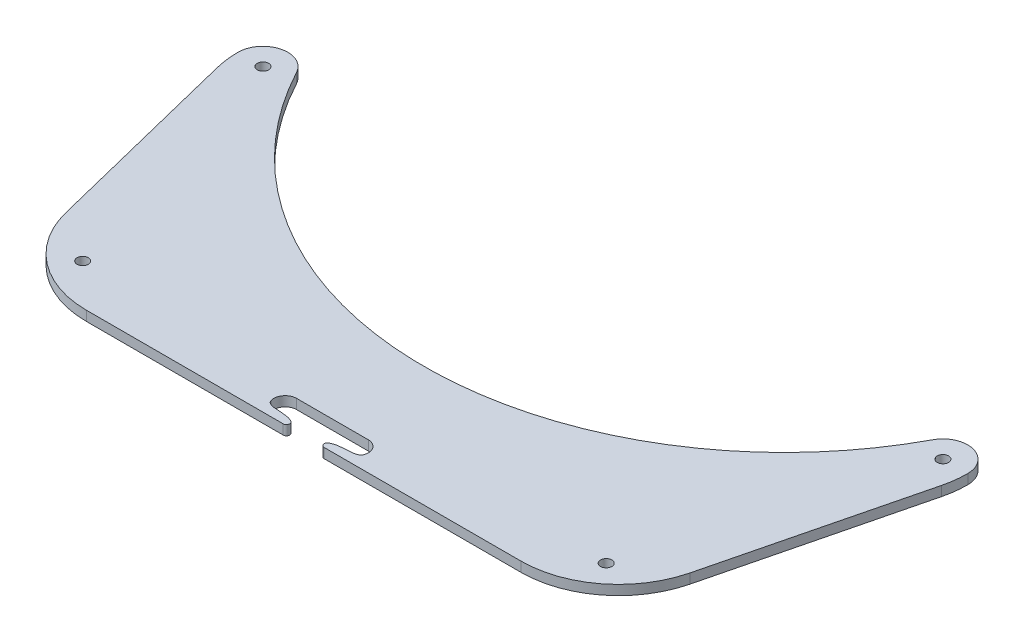
ISO-10303-21;
HEADER;
FILE_DESCRIPTION(('STEP AP214'),'2;1');
FILE_NAME('part.step','',(''),(''),'','','');
FILE_SCHEMA(('AUTOMOTIVE_DESIGN { 1 0 10303 214 1 1 1 1 }'));
ENDSEC;
DATA;
#1=APPLICATION_CONTEXT('core data for automotive mechanical design processes');
#2=APPLICATION_PROTOCOL_DEFINITION('international standard','automotive_design',2000,#1);
#3=PRODUCT_CONTEXT('',#1,'mechanical');
#4=PRODUCT('Part','Part','',(#3));
#5=PRODUCT_RELATED_PRODUCT_CATEGORY('part','',(#4));
#6=PRODUCT_DEFINITION_FORMATION('','',#4);
#7=PRODUCT_DEFINITION_CONTEXT('part definition',#1,'design');
#8=PRODUCT_DEFINITION('design','',#6,#7);
#9=PRODUCT_DEFINITION_SHAPE('','',#8);
#10=(LENGTH_UNIT() NAMED_UNIT(*) SI_UNIT(.MILLI.,.METRE.));
#11=(NAMED_UNIT(*) PLANE_ANGLE_UNIT() SI_UNIT($,.RADIAN.));
#12=(NAMED_UNIT(*) SI_UNIT($,.STERADIAN.) SOLID_ANGLE_UNIT());
#13=UNCERTAINTY_MEASURE_WITH_UNIT(LENGTH_MEASURE(1.E-05),#10,'distance_accuracy_value','');
#14=(GEOMETRIC_REPRESENTATION_CONTEXT(3) GLOBAL_UNCERTAINTY_ASSIGNED_CONTEXT((#13)) GLOBAL_UNIT_ASSIGNED_CONTEXT((#10,
#11,#12)) REPRESENTATION_CONTEXT('',''));
#15=CARTESIAN_POINT('',(0.,0.,0.));
#16=DIRECTION('',(0.,0.,1.));
#17=DIRECTION('',(1.,0.,0.));
#18=AXIS2_PLACEMENT_3D('',#15,#16,#17);
#19=CARTESIAN_POINT('',(0.,3.,29.3456606023015));
#20=DIRECTION('',(0.,0.,-1.));
#21=DIRECTION('',(-1.,0.,0.));
#22=AXIS2_PLACEMENT_3D('',#19,#20,#21);
#23=PLANE('',#22);
#24=DIRECTION('',(0.,1.,0.));
#25=VECTOR('',#24,1.);
#26=CARTESIAN_POINT('',(-6.29344842056771,-7.,29.3456606023015));
#27=LINE('',#26,#25);
#28=CARTESIAN_POINT('',(-6.29344842056771,0.,29.3456606023015));
#29=VERTEX_POINT('',#28);
#30=CARTESIAN_POINT('',(-6.29344842056771,3.,29.3456606023015));
#31=VERTEX_POINT('',#30);
#32=EDGE_CURVE('E210',#29,#31,#27,.T.);
#33=ORIENTED_EDGE('',*,*,#32,.T.);
#34=DIRECTION('',(1.,0.,0.));
#35=VECTOR('',#34,1.);
#36=CARTESIAN_POINT('',(0.,3.,29.3456606023015));
#37=LINE('',#36,#35);
#38=CARTESIAN_POINT('',(-66.7805914104085,3.,29.3456606023015));
#39=VERTEX_POINT('',#38);
#40=EDGE_CURVE('E260',#39,#31,#37,.T.);
#41=ORIENTED_EDGE('',*,*,#40,.F.);
#42=DIRECTION('',(0.,-1.,0.));
#43=VECTOR('',#42,1.);
#44=CARTESIAN_POINT('',(-66.7805914104085,3.,29.3456606023015));
#45=LINE('',#44,#43);
#46=CARTESIAN_POINT('',(-66.7805914104085,0.,29.3456606023015));
#47=VERTEX_POINT('',#46);
#48=EDGE_CURVE('E297',#39,#47,#45,.T.);
#49=ORIENTED_EDGE('',*,*,#48,.T.);
#50=DIRECTION('',(1.,0.,0.));
#51=VECTOR('',#50,1.);
#52=CARTESIAN_POINT('',(0.,0.,29.3456606023015));
#53=LINE('',#52,#51);
#54=EDGE_CURVE('E280',#47,#29,#53,.T.);
#55=ORIENTED_EDGE('',*,*,#54,.T.);
#56=EDGE_LOOP('',(#33,#41,#49,#55));
#57=FACE_BOUND('',#56,.T.);
#58=ADVANCED_FACE('F37',(#57),#23,.F.);
#59=CARTESIAN_POINT('',(-82.1474387367497,3.,-62.6241657822366));
#60=DIRECTION('',(0.,-1.,0.));
#61=DIRECTION('',(0.,0.,-1.));
#62=AXIS2_PLACEMENT_3D('',#59,#60,#61);
#63=CYLINDRICAL_SURFACE('',#62,30.);
#64=DIRECTION('',(0.,1.,0.));
#65=VECTOR('',#64,1.);
#66=CARTESIAN_POINT('',(-112.14743873675,-7.,-62.6241657822366));
#67=LINE('',#66,#65);
#68=CARTESIAN_POINT('',(-112.14743873675,0.,-62.6241657822366));
#69=VERTEX_POINT('',#68);
#70=CARTESIAN_POINT('',(-112.14743873675,3.,-62.6241657822366));
#71=VERTEX_POINT('',#70);
#72=EDGE_CURVE('E241',#69,#71,#67,.T.);
#73=ORIENTED_EDGE('',*,*,#72,.F.);
#74=CARTESIAN_POINT('',(-82.1474387367497,0.,-62.6241657822366));
#75=DIRECTION('',(0.,1.,0.));
#76=DIRECTION('',(0.,0.,1.));
#77=AXIS2_PLACEMENT_3D('',#74,#75,#76);
#78=CIRCLE('',#77,30.);
#79=CARTESIAN_POINT('',(-111.265547961007,0.,-55.4036592069183));
#80=VERTEX_POINT('',#79);
#81=EDGE_CURVE('E245',#69,#80,#78,.T.);
#82=ORIENTED_EDGE('',*,*,#81,.T.);
#83=DIRECTION('',(0.,-1.,0.));
#84=VECTOR('',#83,1.);
#85=CARTESIAN_POINT('',(-111.265547961007,3.,-55.4036592069183));
#86=LINE('',#85,#84);
#87=CARTESIAN_POINT('',(-111.265547961007,3.,-55.4036592069183));
#88=VERTEX_POINT('',#87);
#89=EDGE_CURVE('E301',#88,#80,#86,.T.);
#90=ORIENTED_EDGE('',*,*,#89,.F.);
#91=CARTESIAN_POINT('',(-82.1474387367497,3.,-62.6241657822366));
#92=DIRECTION('',(0.,1.,0.));
#93=DIRECTION('',(0.,0.,1.));
#94=AXIS2_PLACEMENT_3D('',#91,#92,#93);
#95=CIRCLE('',#94,30.);
#96=EDGE_CURVE('E250',#71,#88,#95,.T.);
#97=ORIENTED_EDGE('',*,*,#96,.F.);
#98=EDGE_LOOP('',(#73,#82,#90,#97));
#99=FACE_BOUND('',#98,.T.);
#100=ADVANCED_FACE('F39',(#99),#63,.T.);
#101=CARTESIAN_POINT('',(-91.8773371714655,3.,22.7831042208141));
#102=DIRECTION('',(-0.970603640808581,0.,0.24068355251061));
#103=DIRECTION('',(0.24068355251061,0.,0.970603640808581));
#104=AXIS2_PLACEMENT_3D('',#101,#102,#103);
#105=PLANE('',#104);
#106=DIRECTION('',(-0.24068355251061,0.,-0.970603640808581));
#107=VECTOR('',#106,1.);
#108=CARTESIAN_POINT('',(-91.8773371714655,0.,22.7831042208141));
#109=LINE('',#108,#107);
#110=CARTESIAN_POINT('',(-95.8987006346659,0.,6.56616717761984));
#111=VERTEX_POINT('',#110);
#112=EDGE_CURVE('E273',#111,#80,#109,.T.);
#113=ORIENTED_EDGE('',*,*,#112,.F.);
#114=DIRECTION('',(0.,-1.,0.));
#115=VECTOR('',#114,1.);
#116=CARTESIAN_POINT('',(-95.8987006346659,3.,6.56616717761984));
#117=LINE('',#116,#115);
#118=CARTESIAN_POINT('',(-95.8987006346659,3.,6.56616717761984));
#119=VERTEX_POINT('',#118);
#120=EDGE_CURVE('E299',#119,#111,#117,.T.);
#121=ORIENTED_EDGE('',*,*,#120,.F.);
#122=DIRECTION('',(-0.24068355251061,0.,-0.970603640808581));
#123=VECTOR('',#122,1.);
#124=CARTESIAN_POINT('',(-91.8773371714655,3.,22.7831042208141));
#125=LINE('',#124,#123);
#126=EDGE_CURVE('E252',#119,#88,#125,.T.);
#127=ORIENTED_EDGE('',*,*,#126,.T.);
#128=ORIENTED_EDGE('',*,*,#89,.T.);
#129=EDGE_LOOP('',(#113,#121,#127,#128));
#130=FACE_BOUND('',#129,.T.);
#131=ADVANCED_FACE('F384',(#130),#105,.T.);
#132=CARTESIAN_POINT('',(-66.7805914104085,3.,-0.654339397698461));
#133=DIRECTION('',(0.,-1.,0.));
#134=DIRECTION('',(0.,0.,-1.));
#135=AXIS2_PLACEMENT_3D('',#132,#133,#134);
#136=CYLINDRICAL_SURFACE('',#135,30.);
#137=CARTESIAN_POINT('',(-66.7805914104085,0.,-0.654339397698461));
#138=DIRECTION('',(0.,1.,0.));
#139=DIRECTION('',(0.,0.,1.));
#140=AXIS2_PLACEMENT_3D('',#137,#138,#139);
#141=CIRCLE('',#140,30.);
#142=EDGE_CURVE('E276',#47,#111,#141,.F.);
#143=ORIENTED_EDGE('',*,*,#142,.F.);
#144=ORIENTED_EDGE('',*,*,#48,.F.);
#145=CARTESIAN_POINT('',(-66.7805914104085,3.,-0.654339397698461));
#146=DIRECTION('',(0.,1.,0.));
#147=DIRECTION('',(0.,0.,1.));
#148=AXIS2_PLACEMENT_3D('',#145,#146,#147);
#149=CIRCLE('',#148,30.);
#150=EDGE_CURVE('E256',#39,#119,#149,.F.);
#151=ORIENTED_EDGE('',*,*,#150,.T.);
#152=ORIENTED_EDGE('',*,*,#120,.T.);
#153=EDGE_LOOP('',(#143,#144,#151,#152));
#154=FACE_BOUND('',#153,.T.);
#155=ADVANCED_FACE('F388',(#154),#136,.T.);
#156=CARTESIAN_POINT('',(6.29344842056773,3.,29.3456606023015));
#157=VERTEX_POINT('',#156);
#158=CARTESIAN_POINT('',(66.7805914104085,3.,29.3456606023015));
#159=VERTEX_POINT('',#158);
#160=EDGE_CURVE('E259',#157,#159,#37,.T.);
#161=ORIENTED_EDGE('',*,*,#160,.F.);
#162=DIRECTION('',(0.,1.,0.));
#163=VECTOR('',#162,1.);
#164=CARTESIAN_POINT('',(6.29344842056773,-7.,29.3456606023015));
#165=LINE('',#164,#163);
#166=CARTESIAN_POINT('',(6.29344842056773,0.,29.3456606023015));
#167=VERTEX_POINT('',#166);
#168=EDGE_CURVE('E208',#167,#157,#165,.T.);
#169=ORIENTED_EDGE('',*,*,#168,.F.);
#170=CARTESIAN_POINT('',(66.7805914104085,0.,29.3456606023015));
#171=VERTEX_POINT('',#170);
#172=EDGE_CURVE('E279',#167,#171,#53,.T.);
#173=ORIENTED_EDGE('',*,*,#172,.T.);
#174=DIRECTION('',(0.,-1.,0.));
#175=VECTOR('',#174,1.);
#176=CARTESIAN_POINT('',(66.7805914104085,3.,29.3456606023015));
#177=LINE('',#176,#175);
#178=EDGE_CURVE('E294',#159,#171,#177,.T.);
#179=ORIENTED_EDGE('',*,*,#178,.F.);
#180=EDGE_LOOP('',(#161,#169,#173,#179));
#181=FACE_BOUND('',#180,.T.);
#182=ADVANCED_FACE('F355',(#181),#23,.F.);
#183=CARTESIAN_POINT('',(66.7805914104085,3.,-0.654339397698461));
#184=DIRECTION('',(0.,-1.,0.));
#185=DIRECTION('',(0.,0.,-1.));
#186=AXIS2_PLACEMENT_3D('',#183,#184,#185);
#187=CYLINDRICAL_SURFACE('',#186,30.);
#188=CARTESIAN_POINT('',(66.7805914104085,0.,-0.654339397698461));
#189=DIRECTION('',(0.,1.,0.));
#190=DIRECTION('',(0.,0.,1.));
#191=AXIS2_PLACEMENT_3D('',#188,#189,#190);
#192=CIRCLE('',#191,30.);
#193=CARTESIAN_POINT('',(95.8987006346659,0.,6.56616717761984));
#194=VERTEX_POINT('',#193);
#195=EDGE_CURVE('E283',#194,#171,#192,.F.);
#196=ORIENTED_EDGE('',*,*,#195,.F.);
#197=DIRECTION('',(0.,-1.,0.));
#198=VECTOR('',#197,1.);
#199=CARTESIAN_POINT('',(95.8987006346659,3.,6.56616717761984));
#200=LINE('',#199,#198);
#201=CARTESIAN_POINT('',(95.8987006346659,3.,6.56616717761984));
#202=VERTEX_POINT('',#201);
#203=EDGE_CURVE('E292',#202,#194,#200,.T.);
#204=ORIENTED_EDGE('',*,*,#203,.F.);
#205=CARTESIAN_POINT('',(66.7805914104085,3.,-0.654339397698461));
#206=DIRECTION('',(0.,1.,0.));
#207=DIRECTION('',(0.,0.,1.));
#208=AXIS2_PLACEMENT_3D('',#205,#206,#207);
#209=CIRCLE('',#208,30.);
#210=EDGE_CURVE('E263',#202,#159,#209,.F.);
#211=ORIENTED_EDGE('',*,*,#210,.T.);
#212=ORIENTED_EDGE('',*,*,#178,.T.);
#213=EDGE_LOOP('',(#196,#204,#211,#212));
#214=FACE_BOUND('',#213,.T.);
#215=ADVANCED_FACE('F358',(#214),#187,.T.);
#216=CARTESIAN_POINT('',(91.8773371714655,3.,22.783104220814));
#217=DIRECTION('',(-0.970603640808581,0.,-0.24068355251061));
#218=DIRECTION('',(-0.24068355251061,0.,0.970603640808581));
#219=AXIS2_PLACEMENT_3D('',#216,#217,#218);
#220=PLANE('',#219);
#221=DIRECTION('',(0.24068355251061,0.,-0.970603640808581));
#222=VECTOR('',#221,1.);
#223=CARTESIAN_POINT('',(91.8773371714655,0.,22.783104220814));
#224=LINE('',#223,#222);
#225=CARTESIAN_POINT('',(111.265547961007,0.,-55.4036592069183));
#226=VERTEX_POINT('',#225);
#227=EDGE_CURVE('E286',#194,#226,#224,.T.);
#228=ORIENTED_EDGE('',*,*,#227,.T.);
#229=DIRECTION('',(0.,-1.,0.));
#230=VECTOR('',#229,1.);
#231=CARTESIAN_POINT('',(111.265547961007,3.,-55.4036592069183));
#232=LINE('',#231,#230);
#233=CARTESIAN_POINT('',(111.265547961007,3.,-55.4036592069183));
#234=VERTEX_POINT('',#233);
#235=EDGE_CURVE('E271',#234,#226,#232,.T.);
#236=ORIENTED_EDGE('',*,*,#235,.F.);
#237=DIRECTION('',(0.24068355251061,0.,-0.970603640808581));
#238=VECTOR('',#237,1.);
#239=CARTESIAN_POINT('',(91.8773371714655,3.,22.783104220814));
#240=LINE('',#239,#238);
#241=EDGE_CURVE('E266',#202,#234,#240,.T.);
#242=ORIENTED_EDGE('',*,*,#241,.F.);
#243=ORIENTED_EDGE('',*,*,#203,.T.);
#244=EDGE_LOOP('',(#228,#236,#242,#243));
#245=FACE_BOUND('',#244,.T.);
#246=ADVANCED_FACE('F364',(#245),#220,.F.);
#247=CARTESIAN_POINT('',(82.1474387367497,3.,-62.6241657822366));
#248=DIRECTION('',(0.,-1.,0.));
#249=DIRECTION('',(0.,0.,-1.));
#250=AXIS2_PLACEMENT_3D('',#247,#248,#249);
#251=CYLINDRICAL_SURFACE('',#250,30.);
#252=CARTESIAN_POINT('',(82.1474387367497,0.,-62.6241657822366));
#253=DIRECTION('',(0.,1.,0.));
#254=DIRECTION('',(0.,0.,1.));
#255=AXIS2_PLACEMENT_3D('',#252,#253,#254);
#256=CIRCLE('',#255,30.);
#257=CARTESIAN_POINT('',(112.14743873675,0.,-62.6241657822366));
#258=VERTEX_POINT('',#257);
#259=EDGE_CURVE('E253',#226,#258,#256,.T.);
#260=ORIENTED_EDGE('',*,*,#259,.T.);
#261=DIRECTION('',(0.,1.,0.));
#262=VECTOR('',#261,1.);
#263=CARTESIAN_POINT('',(112.14743873675,-7.,-62.6241657822366));
#264=LINE('',#263,#262);
#265=CARTESIAN_POINT('',(112.14743873675,3.,-62.6241657822366));
#266=VERTEX_POINT('',#265);
#267=EDGE_CURVE('E242',#258,#266,#264,.T.);
#268=ORIENTED_EDGE('',*,*,#267,.T.);
#269=CARTESIAN_POINT('',(82.1474387367497,3.,-62.6241657822366));
#270=DIRECTION('',(0.,1.,0.));
#271=DIRECTION('',(0.,0.,1.));
#272=AXIS2_PLACEMENT_3D('',#269,#270,#271);
#273=CIRCLE('',#272,30.);
#274=EDGE_CURVE('E268',#234,#266,#273,.T.);
#275=ORIENTED_EDGE('',*,*,#274,.F.);
#276=ORIENTED_EDGE('',*,*,#235,.T.);
#277=EDGE_LOOP('',(#260,#268,#275,#276));
#278=FACE_BOUND('',#277,.T.);
#279=ADVANCED_FACE('F368',(#278),#251,.T.);
#280=CARTESIAN_POINT('',(0.,3.,0.));
#281=DIRECTION('',(0.,1.,0.));
#282=DIRECTION('',(0.,0.,1.));
#283=AXIS2_PLACEMENT_3D('',#280,#281,#282);
#284=PLANE('',#283);
#285=CARTESIAN_POINT('',(6.29344842056773,3.,28.3456606023015));
#286=DIRECTION('',(0.,-1.,0.));
#287=DIRECTION('',(0.,0.,1.));
#288=AXIS2_PLACEMENT_3D('',#285,#286,#287);
#289=CIRCLE('',#288,1.);
#290=CARTESIAN_POINT('',(5.80457635502105,3.,27.4733051108142));
#291=VERTEX_POINT('',#290);
#292=EDGE_CURVE('E170',#157,#291,#289,.T.);
#293=ORIENTED_EDGE('',*,*,#292,.F.);
#294=ORIENTED_EDGE('',*,*,#160,.T.);
#295=ORIENTED_EDGE('',*,*,#210,.F.);
#296=ORIENTED_EDGE('',*,*,#241,.T.);
#297=ORIENTED_EDGE('',*,*,#274,.T.);
#298=CARTESIAN_POINT('',(104.507530950677,3.,-62.6241657822366));
#299=DIRECTION('',(0.,-1.,0.));
#300=DIRECTION('',(0.,0.,-1.));
#301=AXIS2_PLACEMENT_3D('',#298,#299,#300);
#302=CIRCLE('',#301,7.63990778607278);
#303=CARTESIAN_POINT('',(97.7669860145428,3.,-66.2204478823578));
#304=VERTEX_POINT('',#303);
#305=EDGE_CURVE('E239',#304,#266,#302,.T.);
#306=ORIENTED_EDGE('',*,*,#305,.F.);
#307=CARTESIAN_POINT('',(0.,3.,-118.382055752085));
#308=DIRECTION('',(0.,1.,0.));
#309=DIRECTION('',(0.,0.,1.));
#310=AXIS2_PLACEMENT_3D('',#307,#308,#309);
#311=CIRCLE('',#310,110.811627954484);
#312=CARTESIAN_POINT('',(-97.7669860145428,3.,-66.2204478823579));
#313=VERTEX_POINT('',#312);
#314=EDGE_CURVE('E236',#313,#304,#311,.T.);
#315=ORIENTED_EDGE('',*,*,#314,.F.);
#316=CARTESIAN_POINT('',(-104.507530950677,3.,-62.6241657822366));
#317=DIRECTION('',(0.,-1.,0.));
#318=DIRECTION('',(0.,0.,1.));
#319=AXIS2_PLACEMENT_3D('',#316,#317,#318);
#320=CIRCLE('',#319,7.6399077860728);
#321=EDGE_CURVE('E234',#71,#313,#320,.T.);
#322=ORIENTED_EDGE('',*,*,#321,.F.);
#323=ORIENTED_EDGE('',*,*,#96,.T.);
#324=ORIENTED_EDGE('',*,*,#126,.F.);
#325=ORIENTED_EDGE('',*,*,#150,.F.);
#326=ORIENTED_EDGE('',*,*,#40,.T.);
#327=CARTESIAN_POINT('',(-6.29344842056771,3.,28.3456606023015));
#328=DIRECTION('',(0.,-1.,0.));
#329=DIRECTION('',(0.,0.,1.));
#330=AXIS2_PLACEMENT_3D('',#327,#328,#329);
#331=CIRCLE('',#330,1.);
#332=CARTESIAN_POINT('',(-5.80457635502104,3.,27.4733051108142));
#333=VERTEX_POINT('',#332);
#334=EDGE_CURVE('E200',#333,#31,#331,.T.);
#335=ORIENTED_EDGE('',*,*,#334,.F.);
#336=CARTESIAN_POINT('',(-14.3784570925038,3.,24.9876745493891));
#337=CARTESIAN_POINT('',(-14.0506615471462,3.,26.1193369399275));
#338=CARTESIAN_POINT('',(-10.489346866623,3.,26.7600909903028));
#339=CARTESIAN_POINT('',(-7.72474957365098,3.,26.4937574664827));
#340=CARTESIAN_POINT('',(-5.90450881564876,3.,27.4173024961474));
#341=CARTESIAN_POINT('',(-5.80457635502104,3.,27.4733051108142));
#342=B_SPLINE_CURVE_WITH_KNOTS('',3,(#336,#337,#338,#339,#340,#341),.UNSPECIFIED.,.F.,.F.,(4,1,
1,4),(0.,0.27412385349263,0.745489655390744,0.777393607827548),.UNSPECIFIED.);
#343=CARTESIAN_POINT('',(-14.3784570925038,3.,24.9876745493891));
#344=VERTEX_POINT('',#343);
#345=EDGE_CURVE('E195',#344,#333,#342,.T.);
#346=ORIENTED_EDGE('',*,*,#345,.F.);
#347=CARTESIAN_POINT('',(-11.0166480970681,3.,24.0138982515634));
#348=DIRECTION('',(0.,1.,0.));
#349=DIRECTION('',(0.,0.,1.));
#350=AXIS2_PLACEMENT_3D('',#347,#348,#349);
#351=CIRCLE('',#350,3.5);
#352=CARTESIAN_POINT('',(-11.0166480970681,3.,20.5138982515634));
#353=VERTEX_POINT('',#352);
#354=EDGE_CURVE('E187',#353,#344,#351,.T.);
#355=ORIENTED_EDGE('',*,*,#354,.F.);
#356=DIRECTION('',(-1.,0.,0.));
#357=VECTOR('',#356,1.);
#358=CARTESIAN_POINT('',(11.0166480970681,3.,20.5138982515634));
#359=LINE('',#358,#357);
#360=CARTESIAN_POINT('',(11.0166480970681,3.,20.5138982515634));
#361=VERTEX_POINT('',#360);
#362=EDGE_CURVE('E185',#361,#353,#359,.T.);
#363=ORIENTED_EDGE('',*,*,#362,.F.);
#364=CARTESIAN_POINT('',(11.0166480970681,3.,24.0138982515634));
#365=DIRECTION('',(0.,1.,0.));
#366=DIRECTION('',(0.,0.,1.));
#367=AXIS2_PLACEMENT_3D('',#364,#365,#366);
#368=CIRCLE('',#367,3.5);
#369=CARTESIAN_POINT('',(14.3784570925038,3.,24.9876745493891));
#370=VERTEX_POINT('',#369);
#371=EDGE_CURVE('E164',#370,#361,#368,.T.);
#372=ORIENTED_EDGE('',*,*,#371,.F.);
#373=CARTESIAN_POINT('',(5.80457635502104,3.,27.4733051108142));
#374=CARTESIAN_POINT('',(5.90450881564877,3.,27.4173024961474));
#375=CARTESIAN_POINT('',(7.724749573651,3.,26.4937574664827));
#376=CARTESIAN_POINT('',(10.489346866623,3.,26.7600909903028));
#377=CARTESIAN_POINT('',(14.0506615471462,3.,26.1193369399275));
#378=CARTESIAN_POINT('',(14.3784570925038,3.,24.9876745493891));
#379=B_SPLINE_CURVE_WITH_KNOTS('',3,(#373,#374,#375,#376,#377,#378),.UNSPECIFIED.,.F.,.F.,(4,1,
1,4),(0.,0.0319039524368033,0.503269754334918,0.777393607827548),.UNSPECIFIED.);
#380=EDGE_CURVE('E173',#291,#370,#379,.T.);
#381=ORIENTED_EDGE('',*,*,#380,.F.);
#382=EDGE_LOOP('',(#293,#294,#295,#296,#297,#306,#315,#322,#323,#324,#325,#326,#335,#346,#355,
#363,#372,#381));
#383=FACE_BOUND('',#382,.T.);
#384=CARTESIAN_POINT('',(-104.507530950677,3.,-62.6241657822366));
#385=DIRECTION('',(0.,1.,0.));
#386=DIRECTION('',(0.,0.,1.));
#387=AXIS2_PLACEMENT_3D('',#384,#385,#386);
#388=CIRCLE('',#387,1.75);
#389=CARTESIAN_POINT('',(-104.507530950677,3.,-60.8741657822366));
#390=VERTEX_POINT('',#389);
#391=EDGE_CURVE('E220',#390,#390,#388,.T.);
#392=ORIENTED_EDGE('',*,*,#391,.F.);
#393=EDGE_LOOP('',(#392));
#394=FACE_BOUND('',#393,.T.);
#395=CARTESIAN_POINT('',(104.507530950677,3.,-62.6241657822366));
#396=DIRECTION('',(0.,1.,0.));
#397=DIRECTION('',(0.,0.,1.));
#398=AXIS2_PLACEMENT_3D('',#395,#396,#397);
#399=CIRCLE('',#398,1.75);
#400=CARTESIAN_POINT('',(104.507530950677,3.,-60.8741657822366));
#401=VERTEX_POINT('',#400);
#402=EDGE_CURVE('E224',#401,#401,#399,.T.);
#403=ORIENTED_EDGE('',*,*,#402,.F.);
#404=EDGE_LOOP('',(#403));
#405=FACE_BOUND('',#404,.T.);
#406=CARTESIAN_POINT('',(80.4501847084653,3.,16.8189513065068));
#407=DIRECTION('',(0.,1.,0.));
#408=DIRECTION('',(0.,0.,1.));
#409=AXIS2_PLACEMENT_3D('',#406,#407,#408);
#410=CIRCLE('',#409,1.75);
#411=CARTESIAN_POINT('',(80.4501847084653,3.,18.5689513065068));
#412=VERTEX_POINT('',#411);
#413=EDGE_CURVE('E207',#412,#412,#410,.T.);
#414=ORIENTED_EDGE('',*,*,#413,.F.);
#415=EDGE_LOOP('',(#414));
#416=FACE_BOUND('',#415,.T.);
#417=CARTESIAN_POINT('',(-80.4501847084653,3.,16.8189513065068));
#418=DIRECTION('',(0.,1.,0.));
#419=DIRECTION('',(0.,0.,1.));
#420=AXIS2_PLACEMENT_3D('',#417,#418,#419);
#421=CIRCLE('',#420,1.75);
#422=CARTESIAN_POINT('',(-80.4501847084653,3.,18.5689513065068));
#423=VERTEX_POINT('',#422);
#424=EDGE_CURVE('E229',#423,#423,#421,.T.);
#425=ORIENTED_EDGE('',*,*,#424,.F.);
#426=EDGE_LOOP('',(#425));
#427=FACE_BOUND('',#426,.T.);
#428=ADVANCED_FACE('F181',(#383,#394,#405,#416,#427),#284,.T.);
#429=CARTESIAN_POINT('',(0.,0.,0.));
#430=DIRECTION('',(0.,1.,0.));
#431=DIRECTION('',(0.,0.,1.));
#432=AXIS2_PLACEMENT_3D('',#429,#430,#431);
#433=PLANE('',#432);
#434=ORIENTED_EDGE('',*,*,#172,.F.);
#435=CARTESIAN_POINT('',(6.29344842056773,0.,28.3456606023015));
#436=DIRECTION('',(0.,1.,0.));
#437=DIRECTION('',(0.,0.,1.));
#438=AXIS2_PLACEMENT_3D('',#435,#436,#437);
#439=CIRCLE('',#438,1.);
#440=CARTESIAN_POINT('',(5.80457635502105,0.,27.4733051108142));
#441=VERTEX_POINT('',#440);
#442=EDGE_CURVE('E11',#167,#441,#439,.F.);
#443=ORIENTED_EDGE('',*,*,#442,.T.);
#444=CARTESIAN_POINT('',(5.80457635502104,0.,27.4733051108142));
#445=CARTESIAN_POINT('',(5.90450881564877,0.,27.4173024961474));
#446=CARTESIAN_POINT('',(7.724749573651,0.,26.4937574664827));
#447=CARTESIAN_POINT('',(10.489346866623,0.,26.7600909903028));
#448=CARTESIAN_POINT('',(14.0506615471462,0.,26.1193369399275));
#449=CARTESIAN_POINT('',(14.3784570925038,0.,24.9876745493891));
#450=B_SPLINE_CURVE_WITH_KNOTS('',3,(#444,#445,#446,#447,#448,#449),.UNSPECIFIED.,.F.,.F.,(4,1,
1,4),(0.,0.0319039524368033,0.503269754334918,0.777393607827548),.UNSPECIFIED.);
#451=CARTESIAN_POINT('',(14.3784570925038,0.,24.9876745493891));
#452=VERTEX_POINT('',#451);
#453=EDGE_CURVE('E45',#441,#452,#450,.T.);
#454=ORIENTED_EDGE('',*,*,#453,.T.);
#455=CARTESIAN_POINT('',(11.0166480970681,0.,24.0138982515634));
#456=DIRECTION('',(0.,1.,0.));
#457=DIRECTION('',(0.,0.,1.));
#458=AXIS2_PLACEMENT_3D('',#455,#456,#457);
#459=CIRCLE('',#458,3.5);
#460=CARTESIAN_POINT('',(11.0166480970681,0.,20.5138982515634));
#461=VERTEX_POINT('',#460);
#462=EDGE_CURVE('E167',#452,#461,#459,.T.);
#463=ORIENTED_EDGE('',*,*,#462,.T.);
#464=DIRECTION('',(-1.,0.,0.));
#465=VECTOR('',#464,1.);
#466=CARTESIAN_POINT('',(0.,0.,20.5138982515634));
#467=LINE('',#466,#465);
#468=CARTESIAN_POINT('',(-11.0166480970681,0.,20.5138982515634));
#469=VERTEX_POINT('',#468);
#470=EDGE_CURVE('E323',#461,#469,#467,.T.);
#471=ORIENTED_EDGE('',*,*,#470,.T.);
#472=CARTESIAN_POINT('',(-11.0166480970681,0.,24.0138982515634));
#473=DIRECTION('',(0.,1.,0.));
#474=DIRECTION('',(0.,0.,1.));
#475=AXIS2_PLACEMENT_3D('',#472,#473,#474);
#476=CIRCLE('',#475,3.5);
#477=CARTESIAN_POINT('',(-14.3784570925038,0.,24.9876745493891));
#478=VERTEX_POINT('',#477);
#479=EDGE_CURVE('E326',#469,#478,#476,.T.);
#480=ORIENTED_EDGE('',*,*,#479,.T.);
#481=CARTESIAN_POINT('',(-14.3784570925038,0.,24.9876745493891));
#482=CARTESIAN_POINT('',(-14.0506615471462,0.,26.1193369399275));
#483=CARTESIAN_POINT('',(-10.489346866623,0.,26.7600909903028));
#484=CARTESIAN_POINT('',(-7.72474957365098,0.,26.4937574664827));
#485=CARTESIAN_POINT('',(-5.90450881564876,0.,27.4173024961474));
#486=CARTESIAN_POINT('',(-5.80457635502104,0.,27.4733051108142));
#487=B_SPLINE_CURVE_WITH_KNOTS('',3,(#481,#482,#483,#484,#485,#486),.UNSPECIFIED.,.F.,.F.,(4,1,
1,4),(0.,0.27412385349263,0.745489655390744,0.777393607827548),.UNSPECIFIED.);
#488=CARTESIAN_POINT('',(-5.80457635502104,0.,27.4733051108142));
#489=VERTEX_POINT('',#488);
#490=EDGE_CURVE('E329',#478,#489,#487,.T.);
#491=ORIENTED_EDGE('',*,*,#490,.T.);
#492=CARTESIAN_POINT('',(-6.29344842056771,0.,28.3456606023015));
#493=DIRECTION('',(0.,1.,0.));
#494=DIRECTION('',(0.,0.,1.));
#495=AXIS2_PLACEMENT_3D('',#492,#493,#494);
#496=CIRCLE('',#495,1.);
#497=EDGE_CURVE('E334',#489,#29,#496,.F.);
#498=ORIENTED_EDGE('',*,*,#497,.T.);
#499=ORIENTED_EDGE('',*,*,#54,.F.);
#500=ORIENTED_EDGE('',*,*,#142,.T.);
#501=ORIENTED_EDGE('',*,*,#112,.T.);
#502=ORIENTED_EDGE('',*,*,#81,.F.);
#503=CARTESIAN_POINT('',(-104.507530950677,0.,-62.6241657822366));
#504=DIRECTION('',(0.,1.,0.));
#505=DIRECTION('',(0.,0.,1.));
#506=AXIS2_PLACEMENT_3D('',#503,#504,#505);
#507=CIRCLE('',#506,7.6399077860728);
#508=CARTESIAN_POINT('',(-97.7669860145428,0.,-66.2204478823579));
#509=VERTEX_POINT('',#508);
#510=EDGE_CURVE('E304',#69,#509,#507,.F.);
#511=ORIENTED_EDGE('',*,*,#510,.T.);
#512=CARTESIAN_POINT('',(0.,0.,-118.382055752085));
#513=DIRECTION('',(0.,1.,0.));
#514=DIRECTION('',(0.,0.,1.));
#515=AXIS2_PLACEMENT_3D('',#512,#513,#514);
#516=CIRCLE('',#515,110.811627954484);
#517=CARTESIAN_POINT('',(97.7669860145428,0.,-66.2204478823578));
#518=VERTEX_POINT('',#517);
#519=EDGE_CURVE('E307',#509,#518,#516,.T.);
#520=ORIENTED_EDGE('',*,*,#519,.T.);
#521=CARTESIAN_POINT('',(104.507530950677,0.,-62.6241657822366));
#522=DIRECTION('',(0.,1.,0.));
#523=DIRECTION('',(0.,0.,1.));
#524=AXIS2_PLACEMENT_3D('',#521,#522,#523);
#525=CIRCLE('',#524,7.63990778607278);
#526=EDGE_CURVE('E310',#518,#258,#525,.F.);
#527=ORIENTED_EDGE('',*,*,#526,.T.);
#528=ORIENTED_EDGE('',*,*,#259,.F.);
#529=ORIENTED_EDGE('',*,*,#227,.F.);
#530=ORIENTED_EDGE('',*,*,#195,.T.);
#531=EDGE_LOOP('',(#434,#443,#454,#463,#471,#480,#491,#498,#499,#500,#501,#502,#511,#520,#527,
#528,#529,#530));
#532=FACE_BOUND('',#531,.T.);
#533=CARTESIAN_POINT('',(-104.507530950677,0.,-62.6241657822366));
#534=DIRECTION('',(0.,1.,0.));
#535=DIRECTION('',(0.,0.,1.));
#536=AXIS2_PLACEMENT_3D('',#533,#534,#535);
#537=CIRCLE('',#536,1.75);
#538=CARTESIAN_POINT('',(-104.507530950677,0.,-60.8741657822366));
#539=VERTEX_POINT('',#538);
#540=EDGE_CURVE('E233',#539,#539,#537,.T.);
#541=ORIENTED_EDGE('',*,*,#540,.T.);
#542=EDGE_LOOP('',(#541));
#543=FACE_BOUND('',#542,.T.);
#544=CARTESIAN_POINT('',(104.507530950677,0.,-62.6241657822366));
#545=DIRECTION('',(0.,1.,0.));
#546=DIRECTION('',(0.,0.,1.));
#547=AXIS2_PLACEMENT_3D('',#544,#545,#546);
#548=CIRCLE('',#547,1.75);
#549=CARTESIAN_POINT('',(104.507530950677,0.,-60.8741657822366));
#550=VERTEX_POINT('',#549);
#551=EDGE_CURVE('E317',#550,#550,#548,.T.);
#552=ORIENTED_EDGE('',*,*,#551,.T.);
#553=EDGE_LOOP('',(#552));
#554=FACE_BOUND('',#553,.T.);
#555=CARTESIAN_POINT('',(80.4501847084653,0.,16.8189513065068));
#556=DIRECTION('',(0.,1.,0.));
#557=DIRECTION('',(0.,0.,1.));
#558=AXIS2_PLACEMENT_3D('',#555,#556,#557);
#559=CIRCLE('',#558,1.75);
#560=CARTESIAN_POINT('',(80.4501847084653,0.,18.5689513065068));
#561=VERTEX_POINT('',#560);
#562=EDGE_CURVE('E223',#561,#561,#559,.T.);
#563=ORIENTED_EDGE('',*,*,#562,.T.);
#564=EDGE_LOOP('',(#563));
#565=FACE_BOUND('',#564,.T.);
#566=CARTESIAN_POINT('',(-80.4501847084653,0.,16.8189513065068));
#567=DIRECTION('',(0.,1.,0.));
#568=DIRECTION('',(0.,0.,1.));
#569=AXIS2_PLACEMENT_3D('',#566,#567,#568);
#570=CIRCLE('',#569,1.75);
#571=CARTESIAN_POINT('',(-80.4501847084653,0.,18.5689513065068));
#572=VERTEX_POINT('',#571);
#573=EDGE_CURVE('E232',#572,#572,#570,.T.);
#574=ORIENTED_EDGE('',*,*,#573,.T.);
#575=EDGE_LOOP('',(#574));
#576=FACE_BOUND('',#575,.T.);
#577=ADVANCED_FACE('F346',(#532,#543,#554,#565,#576),#433,.F.);
#578=CARTESIAN_POINT('',(104.507530950677,-7.,-62.6241657822366));
#579=DIRECTION('',(0.,1.,0.));
#580=DIRECTION('',(0.,0.,1.));
#581=AXIS2_PLACEMENT_3D('',#578,#579,#580);
#582=CYLINDRICAL_SURFACE('',#581,7.63990778607278);
#583=DIRECTION('',(0.,1.,0.));
#584=VECTOR('',#583,1.);
#585=CARTESIAN_POINT('',(97.7669860145428,-7.,-66.2204478823578));
#586=LINE('',#585,#584);
#587=EDGE_CURVE('E246',#518,#304,#586,.T.);
#588=ORIENTED_EDGE('',*,*,#587,.T.);
#589=ORIENTED_EDGE('',*,*,#305,.T.);
#590=ORIENTED_EDGE('',*,*,#267,.F.);
#591=ORIENTED_EDGE('',*,*,#526,.F.);
#592=EDGE_LOOP('',(#588,#589,#590,#591));
#593=FACE_BOUND('',#592,.T.);
#594=ADVANCED_FACE('F370',(#593),#582,.T.);
#595=CARTESIAN_POINT('',(0.,-7.,-118.382055752085));
#596=DIRECTION('',(0.,1.,0.));
#597=DIRECTION('',(0.,0.,1.));
#598=AXIS2_PLACEMENT_3D('',#595,#596,#597);
#599=CYLINDRICAL_SURFACE('',#598,110.811627954484);
#600=DIRECTION('',(0.,1.,0.));
#601=VECTOR('',#600,1.);
#602=CARTESIAN_POINT('',(-97.7669860145428,-7.,-66.2204478823579));
#603=LINE('',#602,#601);
#604=EDGE_CURVE('E60',#509,#313,#603,.T.);
#605=ORIENTED_EDGE('',*,*,#604,.T.);
#606=ORIENTED_EDGE('',*,*,#314,.T.);
#607=ORIENTED_EDGE('',*,*,#587,.F.);
#608=ORIENTED_EDGE('',*,*,#519,.F.);
#609=EDGE_LOOP('',(#605,#606,#607,#608));
#610=FACE_BOUND('',#609,.T.);
#611=ADVANCED_FACE('F374',(#610),#599,.F.);
#612=CARTESIAN_POINT('',(-104.507530950677,-7.,-62.6241657822366));
#613=DIRECTION('',(0.,1.,0.));
#614=DIRECTION('',(0.,0.,1.));
#615=AXIS2_PLACEMENT_3D('',#612,#613,#614);
#616=CYLINDRICAL_SURFACE('',#615,7.6399077860728);
#617=ORIENTED_EDGE('',*,*,#72,.T.);
#618=ORIENTED_EDGE('',*,*,#321,.T.);
#619=ORIENTED_EDGE('',*,*,#604,.F.);
#620=ORIENTED_EDGE('',*,*,#510,.F.);
#621=EDGE_LOOP('',(#617,#618,#619,#620));
#622=FACE_BOUND('',#621,.T.);
#623=ADVANCED_FACE('F481',(#622),#616,.T.);
#624=CARTESIAN_POINT('',(-80.4501847084653,-7.,16.8189513065068));
#625=DIRECTION('',(0.,1.,0.));
#626=DIRECTION('',(0.,0.,1.));
#627=AXIS2_PLACEMENT_3D('',#624,#625,#626);
#628=CYLINDRICAL_SURFACE('',#627,1.75);
#629=ORIENTED_EDGE('',*,*,#424,.T.);
#630=EDGE_LOOP('',(#629));
#631=FACE_BOUND('',#630,.T.);
#632=ORIENTED_EDGE('',*,*,#573,.F.);
#633=EDGE_LOOP('',(#632));
#634=FACE_BOUND('',#633,.T.);
#635=ADVANCED_FACE('F490',(#631,#634),#628,.F.);
#636=CARTESIAN_POINT('',(80.4501847084653,-7.,16.8189513065068));
#637=DIRECTION('',(0.,1.,0.));
#638=DIRECTION('',(0.,0.,1.));
#639=AXIS2_PLACEMENT_3D('',#636,#637,#638);
#640=CYLINDRICAL_SURFACE('',#639,1.75);
#641=ORIENTED_EDGE('',*,*,#413,.T.);
#642=EDGE_LOOP('',(#641));
#643=FACE_BOUND('',#642,.T.);
#644=ORIENTED_EDGE('',*,*,#562,.F.);
#645=EDGE_LOOP('',(#644));
#646=FACE_BOUND('',#645,.T.);
#647=ADVANCED_FACE('F499',(#643,#646),#640,.F.);
#648=CARTESIAN_POINT('',(104.507530950677,-7.,-62.6241657822366));
#649=DIRECTION('',(0.,1.,0.));
#650=DIRECTION('',(0.,0.,1.));
#651=AXIS2_PLACEMENT_3D('',#648,#649,#650);
#652=CYLINDRICAL_SURFACE('',#651,1.75);
#653=ORIENTED_EDGE('',*,*,#402,.T.);
#654=EDGE_LOOP('',(#653));
#655=FACE_BOUND('',#654,.T.);
#656=ORIENTED_EDGE('',*,*,#551,.F.);
#657=EDGE_LOOP('',(#656));
#658=FACE_BOUND('',#657,.T.);
#659=ADVANCED_FACE('F509',(#655,#658),#652,.F.);
#660=CARTESIAN_POINT('',(-104.507530950677,-7.,-62.6241657822366));
#661=DIRECTION('',(0.,1.,0.));
#662=DIRECTION('',(0.,0.,1.));
#663=AXIS2_PLACEMENT_3D('',#660,#661,#662);
#664=CYLINDRICAL_SURFACE('',#663,1.75);
#665=ORIENTED_EDGE('',*,*,#391,.T.);
#666=EDGE_LOOP('',(#665));
#667=FACE_BOUND('',#666,.T.);
#668=ORIENTED_EDGE('',*,*,#540,.F.);
#669=EDGE_LOOP('',(#668));
#670=FACE_BOUND('',#669,.T.);
#671=ADVANCED_FACE('F518',(#667,#670),#664,.F.);
#672=CARTESIAN_POINT('',(5.80457635502104,-7.,27.4733051108142));
#673=CARTESIAN_POINT('',(5.90450881564877,-7.,27.4173024961474));
#674=CARTESIAN_POINT('',(7.724749573651,-7.,26.4937574664827));
#675=CARTESIAN_POINT('',(10.489346866623,-7.,26.7600909903028));
#676=CARTESIAN_POINT('',(14.0506615471462,-7.,26.1193369399275));
#677=CARTESIAN_POINT('',(14.3784570925038,-7.,24.9876745493891));
#678=B_SPLINE_CURVE_WITH_KNOTS('',3,(#672,#673,#674,#675,#676,#677),.UNSPECIFIED.,.F.,.F.,(4,1,
1,4),(0.,0.0319039524368033,0.503269754334918,0.777393607827548),.UNSPECIFIED.);
#679=DIRECTION('',(0.,1.,0.));
#680=VECTOR('',#679,1.);
#681=SURFACE_OF_LINEAR_EXTRUSION('',#678,#680);
#682=DIRECTION('',(0.,1.,0.));
#683=VECTOR('',#682,1.);
#684=CARTESIAN_POINT('',(5.80457635502105,-7.,27.4733051108142));
#685=LINE('',#684,#683);
#686=EDGE_CURVE('E176',#441,#291,#685,.T.);
#687=ORIENTED_EDGE('',*,*,#686,.T.);
#688=ORIENTED_EDGE('',*,*,#380,.T.);
#689=DIRECTION('',(0.,1.,0.));
#690=VECTOR('',#689,1.);
#691=CARTESIAN_POINT('',(14.3784570925038,-7.,24.9876745493891));
#692=LINE('',#691,#690);
#693=EDGE_CURVE('E160',#452,#370,#692,.T.);
#694=ORIENTED_EDGE('',*,*,#693,.F.);
#695=ORIENTED_EDGE('',*,*,#453,.F.);
#696=EDGE_LOOP('',(#687,#688,#694,#695));
#697=FACE_BOUND('',#696,.T.);
#698=ADVANCED_FACE('F174',(#697),#681,.F.);
#699=CARTESIAN_POINT('',(6.29344842056773,-7.,28.3456606023015));
#700=DIRECTION('',(0.,1.,0.));
#701=DIRECTION('',(0.,0.,1.));
#702=AXIS2_PLACEMENT_3D('',#699,#700,#701);
#703=CYLINDRICAL_SURFACE('',#702,1.);
#704=ORIENTED_EDGE('',*,*,#168,.T.);
#705=ORIENTED_EDGE('',*,*,#292,.T.);
#706=ORIENTED_EDGE('',*,*,#686,.F.);
#707=ORIENTED_EDGE('',*,*,#442,.F.);
#708=EDGE_LOOP('',(#704,#705,#706,#707));
#709=FACE_BOUND('',#708,.T.);
#710=ADVANCED_FACE('F349',(#709),#703,.T.);
#711=CARTESIAN_POINT('',(-6.29344842056771,-7.,28.3456606023015));
#712=DIRECTION('',(0.,1.,0.));
#713=DIRECTION('',(0.,0.,1.));
#714=AXIS2_PLACEMENT_3D('',#711,#712,#713);
#715=CYLINDRICAL_SURFACE('',#714,1.);
#716=DIRECTION('',(0.,1.,0.));
#717=VECTOR('',#716,1.);
#718=CARTESIAN_POINT('',(-5.80457635502104,-7.,27.4733051108142));
#719=LINE('',#718,#717);
#720=EDGE_CURVE('E213',#489,#333,#719,.T.);
#721=ORIENTED_EDGE('',*,*,#720,.T.);
#722=ORIENTED_EDGE('',*,*,#334,.T.);
#723=ORIENTED_EDGE('',*,*,#32,.F.);
#724=ORIENTED_EDGE('',*,*,#497,.F.);
#725=EDGE_LOOP('',(#721,#722,#723,#724));
#726=FACE_BOUND('',#725,.T.);
#727=ADVANCED_FACE('F395',(#726),#715,.T.);
#728=CARTESIAN_POINT('',(-14.3784570925038,-7.,24.9876745493891));
#729=CARTESIAN_POINT('',(-14.0506615471462,-7.,26.1193369399275));
#730=CARTESIAN_POINT('',(-10.489346866623,-7.,26.7600909903028));
#731=CARTESIAN_POINT('',(-7.72474957365098,-7.,26.4937574664827));
#732=CARTESIAN_POINT('',(-5.90450881564876,-7.,27.4173024961474));
#733=CARTESIAN_POINT('',(-5.80457635502104,-7.,27.4733051108142));
#734=B_SPLINE_CURVE_WITH_KNOTS('',3,(#728,#729,#730,#731,#732,#733),.UNSPECIFIED.,.F.,.F.,(4,1,
1,4),(0.,0.27412385349263,0.745489655390744,0.777393607827548),.UNSPECIFIED.);
#735=DIRECTION('',(0.,1.,0.));
#736=VECTOR('',#735,1.);
#737=SURFACE_OF_LINEAR_EXTRUSION('',#734,#736);
#738=DIRECTION('',(0.,1.,0.));
#739=VECTOR('',#738,1.);
#740=CARTESIAN_POINT('',(-14.3784570925038,-7.,24.9876745493891));
#741=LINE('',#740,#739);
#742=EDGE_CURVE('E215',#478,#344,#741,.T.);
#743=ORIENTED_EDGE('',*,*,#742,.T.);
#744=ORIENTED_EDGE('',*,*,#345,.T.);
#745=ORIENTED_EDGE('',*,*,#720,.F.);
#746=ORIENTED_EDGE('',*,*,#490,.F.);
#747=EDGE_LOOP('',(#743,#744,#745,#746));
#748=FACE_BOUND('',#747,.T.);
#749=ADVANCED_FACE('F398',(#748),#737,.F.);
#750=CARTESIAN_POINT('',(-11.0166480970681,-7.,24.0138982515634));
#751=DIRECTION('',(0.,1.,0.));
#752=DIRECTION('',(0.,0.,1.));
#753=AXIS2_PLACEMENT_3D('',#750,#751,#752);
#754=CYLINDRICAL_SURFACE('',#753,3.5);
#755=DIRECTION('',(0.,1.,0.));
#756=VECTOR('',#755,1.);
#757=CARTESIAN_POINT('',(-11.0166480970681,-7.,20.5138982515634));
#758=LINE('',#757,#756);
#759=EDGE_CURVE('E217',#469,#353,#758,.T.);
#760=ORIENTED_EDGE('',*,*,#759,.T.);
#761=ORIENTED_EDGE('',*,*,#354,.T.);
#762=ORIENTED_EDGE('',*,*,#742,.F.);
#763=ORIENTED_EDGE('',*,*,#479,.F.);
#764=EDGE_LOOP('',(#760,#761,#762,#763));
#765=FACE_BOUND('',#764,.T.);
#766=ADVANCED_FACE('F401',(#765),#754,.F.);
#767=CARTESIAN_POINT('',(11.0166480970681,-7.,20.5138982515634));
#768=DIRECTION('',(0.,0.,-1.));
#769=DIRECTION('',(-1.,0.,0.));
#770=AXIS2_PLACEMENT_3D('',#767,#768,#769);
#771=PLANE('',#770);
#772=DIRECTION('',(0.,1.,0.));
#773=VECTOR('',#772,1.);
#774=CARTESIAN_POINT('',(11.0166480970681,-7.,20.5138982515634));
#775=LINE('',#774,#773);
#776=EDGE_CURVE('E52',#461,#361,#775,.T.);
#777=ORIENTED_EDGE('',*,*,#776,.T.);
#778=ORIENTED_EDGE('',*,*,#362,.T.);
#779=ORIENTED_EDGE('',*,*,#759,.F.);
#780=ORIENTED_EDGE('',*,*,#470,.F.);
#781=EDGE_LOOP('',(#777,#778,#779,#780));
#782=FACE_BOUND('',#781,.T.);
#783=ADVANCED_FACE('F404',(#782),#771,.F.);
#784=CARTESIAN_POINT('',(11.0166480970681,-7.,24.0138982515634));
#785=DIRECTION('',(0.,1.,0.));
#786=DIRECTION('',(0.,0.,1.));
#787=AXIS2_PLACEMENT_3D('',#784,#785,#786);
#788=CYLINDRICAL_SURFACE('',#787,3.5);
#789=ORIENTED_EDGE('',*,*,#693,.T.);
#790=ORIENTED_EDGE('',*,*,#371,.T.);
#791=ORIENTED_EDGE('',*,*,#776,.F.);
#792=ORIENTED_EDGE('',*,*,#462,.F.);
#793=EDGE_LOOP('',(#789,#790,#791,#792));
#794=FACE_BOUND('',#793,.T.);
#795=ADVANCED_FACE('F162',(#794),#788,.F.);
#796=CLOSED_SHELL('',(#58,#100,#131,#155,#182,#215,#246,#279,#428,#577,#594,#611,#623,#635,#647,
#659,#671,#698,#710,#727,#749,#766,#783,#795));
#797=MANIFOLD_SOLID_BREP('B2',#796);
#798=ADVANCED_BREP_SHAPE_REPRESENTATION('',(#18,#797),#14);
#799=SHAPE_DEFINITION_REPRESENTATION(#9,#798);
ENDSEC;
END-ISO-10303-21;
